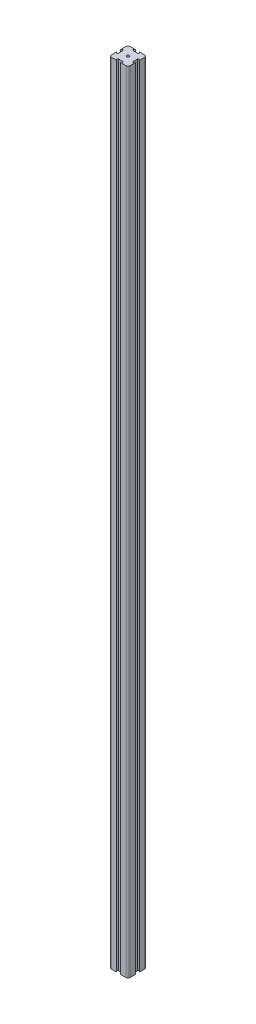
ISO-10303-21;
HEADER;
FILE_DESCRIPTION(('STEP AP214'),'2;1');
FILE_NAME('part.step','',(''),(''),'','','');
FILE_SCHEMA(('AUTOMOTIVE_DESIGN { 1 0 10303 214 1 1 1 1 }'));
ENDSEC;
DATA;
#1=APPLICATION_CONTEXT('core data for automotive mechanical design processes');
#2=APPLICATION_PROTOCOL_DEFINITION('international standard','automotive_design',2000,#1);
#3=PRODUCT_CONTEXT('',#1,'mechanical');
#4=PRODUCT('Part','Part','',(#3));
#5=PRODUCT_RELATED_PRODUCT_CATEGORY('part','',(#4));
#6=PRODUCT_DEFINITION_FORMATION('','',#4);
#7=PRODUCT_DEFINITION_CONTEXT('part definition',#1,'design');
#8=PRODUCT_DEFINITION('design','',#6,#7);
#9=PRODUCT_DEFINITION_SHAPE('','',#8);
#10=(LENGTH_UNIT() NAMED_UNIT(*) SI_UNIT(.MILLI.,.METRE.));
#11=(NAMED_UNIT(*) PLANE_ANGLE_UNIT() SI_UNIT($,.RADIAN.));
#12=(NAMED_UNIT(*) SI_UNIT($,.STERADIAN.) SOLID_ANGLE_UNIT());
#13=UNCERTAINTY_MEASURE_WITH_UNIT(LENGTH_MEASURE(1.E-05),#10,'distance_accuracy_value','');
#14=(GEOMETRIC_REPRESENTATION_CONTEXT(3) GLOBAL_UNCERTAINTY_ASSIGNED_CONTEXT((#13)) GLOBAL_UNIT_ASSIGNED_CONTEXT((#10,
#11,#12)) REPRESENTATION_CONTEXT('',''));
#15=CARTESIAN_POINT('',(0.,0.,0.));
#16=DIRECTION('',(0.,0.,1.));
#17=DIRECTION('',(1.,0.,0.));
#18=AXIS2_PLACEMENT_3D('',#15,#16,#17);
#19=CARTESIAN_POINT('',(-20.,1900.,5.));
#20=DIRECTION('',(0.,-1.,0.));
#21=DIRECTION('',(0.,0.,-1.));
#22=AXIS2_PLACEMENT_3D('',#19,#20,#21);
#23=CYLINDRICAL_SURFACE('',#22,2.5);
#24=CARTESIAN_POINT('',(-20.,0.,5.));
#25=DIRECTION('',(0.,-1.,0.));
#26=DIRECTION('',(0.,0.,-1.));
#27=AXIS2_PLACEMENT_3D('',#24,#25,#26);
#28=CIRCLE('',#27,2.5);
#29=CARTESIAN_POINT('',(-17.5,0.,5.));
#30=VERTEX_POINT('',#29);
#31=CARTESIAN_POINT('',(-22.5,0.,5.));
#32=VERTEX_POINT('',#31);
#33=EDGE_CURVE('E225',#30,#32,#28,.T.);
#34=ORIENTED_EDGE('',*,*,#33,.T.);
#35=DIRECTION('',(0.,-1.,0.));
#36=VECTOR('',#35,1.);
#37=CARTESIAN_POINT('',(-22.5,1900.,5.));
#38=LINE('',#37,#36);
#39=CARTESIAN_POINT('',(-22.5,1900.,5.));
#40=VERTEX_POINT('',#39);
#41=EDGE_CURVE('E11',#40,#32,#38,.T.);
#42=ORIENTED_EDGE('',*,*,#41,.F.);
#43=CARTESIAN_POINT('',(-20.,1900.,5.));
#44=DIRECTION('',(0.,-1.,0.));
#45=DIRECTION('',(0.,0.,-1.));
#46=AXIS2_PLACEMENT_3D('',#43,#44,#45);
#47=CIRCLE('',#46,2.5);
#48=CARTESIAN_POINT('',(-17.5,1900.,5.));
#49=VERTEX_POINT('',#48);
#50=EDGE_CURVE('E290',#49,#40,#47,.T.);
#51=ORIENTED_EDGE('',*,*,#50,.F.);
#52=DIRECTION('',(0.,-1.,0.));
#53=VECTOR('',#52,1.);
#54=CARTESIAN_POINT('',(-17.5,1900.,5.));
#55=LINE('',#54,#53);
#56=EDGE_CURVE('E221',#49,#30,#55,.T.);
#57=ORIENTED_EDGE('',*,*,#56,.T.);
#58=EDGE_LOOP('',(#34,#42,#51,#57));
#59=FACE_BOUND('',#58,.T.);
#60=ADVANCED_FACE('F33',(#59),#23,.F.);
#61=CARTESIAN_POINT('',(-22.5,1900.,5.));
#62=DIRECTION('',(1.,0.,0.));
#63=DIRECTION('',(0.,0.,-1.));
#64=AXIS2_PLACEMENT_3D('',#61,#62,#63);
#65=PLANE('',#64);
#66=DIRECTION('',(0.,0.,1.));
#67=VECTOR('',#66,1.);
#68=CARTESIAN_POINT('',(-22.5,0.,5.));
#69=LINE('',#68,#67);
#70=CARTESIAN_POINT('',(-22.5,0.,17.4999999999999));
#71=VERTEX_POINT('',#70);
#72=EDGE_CURVE('E228',#32,#71,#69,.T.);
#73=ORIENTED_EDGE('',*,*,#72,.T.);
#74=DIRECTION('',(0.,-1.,0.));
#75=VECTOR('',#74,1.);
#76=CARTESIAN_POINT('',(-22.5,1900.,17.4999999999999));
#77=LINE('',#76,#75);
#78=CARTESIAN_POINT('',(-22.5,1900.,17.4999999999999));
#79=VERTEX_POINT('',#78);
#80=EDGE_CURVE('E41',#79,#71,#77,.T.);
#81=ORIENTED_EDGE('',*,*,#80,.F.);
#82=DIRECTION('',(0.,0.,1.));
#83=VECTOR('',#82,1.);
#84=CARTESIAN_POINT('',(-22.5,1900.,5.));
#85=LINE('',#84,#83);
#86=EDGE_CURVE('E136',#40,#79,#85,.T.);
#87=ORIENTED_EDGE('',*,*,#86,.F.);
#88=ORIENTED_EDGE('',*,*,#41,.T.);
#89=EDGE_LOOP('',(#73,#81,#87,#88));
#90=FACE_BOUND('',#89,.T.);
#91=ADVANCED_FACE('F417',(#90),#65,.F.);
#92=CARTESIAN_POINT('',(-17.5,1900.,17.5));
#93=DIRECTION('',(0.,-1.,0.));
#94=DIRECTION('',(0.,0.,-1.));
#95=AXIS2_PLACEMENT_3D('',#92,#93,#94);
#96=CYLINDRICAL_SURFACE('',#95,5.);
#97=CARTESIAN_POINT('',(-17.5,0.,17.5));
#98=DIRECTION('',(0.,1.,0.));
#99=DIRECTION('',(0.,0.,1.));
#100=AXIS2_PLACEMENT_3D('',#97,#98,#99);
#101=CIRCLE('',#100,5.);
#102=CARTESIAN_POINT('',(-17.5,0.,22.5));
#103=VERTEX_POINT('',#102);
#104=EDGE_CURVE('E231',#71,#103,#101,.T.);
#105=ORIENTED_EDGE('',*,*,#104,.T.);
#106=DIRECTION('',(0.,-1.,0.));
#107=VECTOR('',#106,1.);
#108=CARTESIAN_POINT('',(-17.5,1900.,22.5));
#109=LINE('',#108,#107);
#110=CARTESIAN_POINT('',(-17.5,1900.,22.5));
#111=VERTEX_POINT('',#110);
#112=EDGE_CURVE('E329',#111,#103,#109,.T.);
#113=ORIENTED_EDGE('',*,*,#112,.F.);
#114=CARTESIAN_POINT('',(-17.5,1900.,17.5));
#115=DIRECTION('',(0.,1.,0.));
#116=DIRECTION('',(0.,0.,1.));
#117=AXIS2_PLACEMENT_3D('',#114,#115,#116);
#118=CIRCLE('',#117,5.);
#119=EDGE_CURVE('E336',#79,#111,#118,.T.);
#120=ORIENTED_EDGE('',*,*,#119,.F.);
#121=ORIENTED_EDGE('',*,*,#80,.T.);
#122=EDGE_LOOP('',(#105,#113,#120,#121));
#123=FACE_BOUND('',#122,.T.);
#124=ADVANCED_FACE('F334',(#123),#96,.T.);
#125=CARTESIAN_POINT('',(-4.99999999999998,1900.,22.5));
#126=DIRECTION('',(0.,0.,1.));
#127=DIRECTION('',(1.,0.,0.));
#128=AXIS2_PLACEMENT_3D('',#125,#126,#127);
#129=PLANE('',#128);
#130=DIRECTION('',(-1.,0.,0.));
#131=VECTOR('',#130,1.);
#132=CARTESIAN_POINT('',(-4.99999999999998,0.,22.5));
#133=LINE('',#132,#131);
#134=CARTESIAN_POINT('',(-4.99999999999998,0.,22.5));
#135=VERTEX_POINT('',#134);
#136=EDGE_CURVE('E234',#135,#103,#133,.T.);
#137=ORIENTED_EDGE('',*,*,#136,.F.);
#138=DIRECTION('',(0.,-1.,0.));
#139=VECTOR('',#138,1.);
#140=CARTESIAN_POINT('',(-4.99999999999998,1900.,22.5));
#141=LINE('',#140,#139);
#142=CARTESIAN_POINT('',(-4.99999999999998,1900.,22.5));
#143=VERTEX_POINT('',#142);
#144=EDGE_CURVE('E327',#143,#135,#141,.T.);
#145=ORIENTED_EDGE('',*,*,#144,.F.);
#146=DIRECTION('',(-1.,0.,0.));
#147=VECTOR('',#146,1.);
#148=CARTESIAN_POINT('',(-4.99999999999998,1900.,22.5));
#149=LINE('',#148,#147);
#150=EDGE_CURVE('E347',#143,#111,#149,.T.);
#151=ORIENTED_EDGE('',*,*,#150,.T.);
#152=ORIENTED_EDGE('',*,*,#112,.T.);
#153=EDGE_LOOP('',(#137,#145,#151,#152));
#154=FACE_BOUND('',#153,.T.);
#155=ADVANCED_FACE('F344',(#154),#129,.T.);
#156=CARTESIAN_POINT('',(-5.,1900.,20.));
#157=DIRECTION('',(0.,-1.,0.));
#158=DIRECTION('',(0.,0.,-1.));
#159=AXIS2_PLACEMENT_3D('',#156,#157,#158);
#160=CYLINDRICAL_SURFACE('',#159,2.5);
#161=CARTESIAN_POINT('',(-5.,0.,20.));
#162=DIRECTION('',(0.,1.,0.));
#163=DIRECTION('',(0.,0.,1.));
#164=AXIS2_PLACEMENT_3D('',#161,#162,#163);
#165=CIRCLE('',#164,2.5);
#166=CARTESIAN_POINT('',(-4.99999999999998,0.,17.5));
#167=VERTEX_POINT('',#166);
#168=EDGE_CURVE('E237',#167,#135,#165,.T.);
#169=ORIENTED_EDGE('',*,*,#168,.F.);
#170=DIRECTION('',(0.,-1.,0.));
#171=VECTOR('',#170,1.);
#172=CARTESIAN_POINT('',(-4.99999999999998,1900.,17.5));
#173=LINE('',#172,#171);
#174=CARTESIAN_POINT('',(-4.99999999999998,1900.,17.5));
#175=VERTEX_POINT('',#174);
#176=EDGE_CURVE('E325',#175,#167,#173,.T.);
#177=ORIENTED_EDGE('',*,*,#176,.F.);
#178=CARTESIAN_POINT('',(-5.,1900.,20.));
#179=DIRECTION('',(0.,1.,0.));
#180=DIRECTION('',(0.,0.,1.));
#181=AXIS2_PLACEMENT_3D('',#178,#179,#180);
#182=CIRCLE('',#181,2.5);
#183=EDGE_CURVE('E350',#175,#143,#182,.T.);
#184=ORIENTED_EDGE('',*,*,#183,.T.);
#185=ORIENTED_EDGE('',*,*,#144,.T.);
#186=EDGE_LOOP('',(#169,#177,#184,#185));
#187=FACE_BOUND('',#186,.T.);
#188=ADVANCED_FACE('F624',(#187),#160,.F.);
#189=CARTESIAN_POINT('',(-4.99999999999998,1900.,17.5));
#190=DIRECTION('',(0.,0.,-1.));
#191=DIRECTION('',(-1.,0.,0.));
#192=AXIS2_PLACEMENT_3D('',#189,#190,#191);
#193=PLANE('',#192);
#194=DIRECTION('',(1.,0.,0.));
#195=VECTOR('',#194,1.);
#196=CARTESIAN_POINT('',(-4.99999999999998,0.,17.5));
#197=LINE('',#196,#195);
#198=CARTESIAN_POINT('',(5.00000000000002,0.,17.5));
#199=VERTEX_POINT('',#198);
#200=EDGE_CURVE('E240',#167,#199,#197,.T.);
#201=ORIENTED_EDGE('',*,*,#200,.T.);
#202=DIRECTION('',(0.,-1.,0.));
#203=VECTOR('',#202,1.);
#204=CARTESIAN_POINT('',(5.00000000000002,1900.,17.5));
#205=LINE('',#204,#203);
#206=CARTESIAN_POINT('',(5.00000000000002,1900.,17.5));
#207=VERTEX_POINT('',#206);
#208=EDGE_CURVE('E323',#207,#199,#205,.T.);
#209=ORIENTED_EDGE('',*,*,#208,.F.);
#210=DIRECTION('',(1.,0.,0.));
#211=VECTOR('',#210,1.);
#212=CARTESIAN_POINT('',(-4.99999999999998,1900.,17.5));
#213=LINE('',#212,#211);
#214=EDGE_CURVE('E352',#175,#207,#213,.T.);
#215=ORIENTED_EDGE('',*,*,#214,.F.);
#216=ORIENTED_EDGE('',*,*,#176,.T.);
#217=EDGE_LOOP('',(#201,#209,#215,#216));
#218=FACE_BOUND('',#217,.T.);
#219=ADVANCED_FACE('F614',(#218),#193,.F.);
#220=CARTESIAN_POINT('',(4.99999999999996,1900.,20.));
#221=DIRECTION('',(0.,-1.,0.));
#222=DIRECTION('',(0.,0.,-1.));
#223=AXIS2_PLACEMENT_3D('',#220,#221,#222);
#224=CYLINDRICAL_SURFACE('',#223,2.50000000000001);
#225=CARTESIAN_POINT('',(4.99999999999996,0.,20.));
#226=DIRECTION('',(0.,1.,0.));
#227=DIRECTION('',(0.,0.,1.));
#228=AXIS2_PLACEMENT_3D('',#225,#226,#227);
#229=CIRCLE('',#228,2.50000000000001);
#230=CARTESIAN_POINT('',(4.99999999999996,0.,22.5));
#231=VERTEX_POINT('',#230);
#232=EDGE_CURVE('E243',#231,#199,#229,.T.);
#233=ORIENTED_EDGE('',*,*,#232,.F.);
#234=DIRECTION('',(0.,-1.,0.));
#235=VECTOR('',#234,1.);
#236=CARTESIAN_POINT('',(4.99999999999996,1900.,22.5));
#237=LINE('',#236,#235);
#238=CARTESIAN_POINT('',(4.99999999999996,1900.,22.5));
#239=VERTEX_POINT('',#238);
#240=EDGE_CURVE('E321',#239,#231,#237,.T.);
#241=ORIENTED_EDGE('',*,*,#240,.F.);
#242=CARTESIAN_POINT('',(4.99999999999996,1900.,20.));
#243=DIRECTION('',(0.,1.,0.));
#244=DIRECTION('',(0.,0.,1.));
#245=AXIS2_PLACEMENT_3D('',#242,#243,#244);
#246=CIRCLE('',#245,2.50000000000001);
#247=EDGE_CURVE('E358',#239,#207,#246,.T.);
#248=ORIENTED_EDGE('',*,*,#247,.T.);
#249=ORIENTED_EDGE('',*,*,#208,.T.);
#250=EDGE_LOOP('',(#233,#241,#248,#249));
#251=FACE_BOUND('',#250,.T.);
#252=ADVANCED_FACE('F604',(#251),#224,.F.);
#253=CARTESIAN_POINT('',(4.99999999999996,1900.,22.5));
#254=DIRECTION('',(0.,0.,-1.));
#255=DIRECTION('',(-1.,0.,0.));
#256=AXIS2_PLACEMENT_3D('',#253,#254,#255);
#257=PLANE('',#256);
#258=DIRECTION('',(1.,0.,0.));
#259=VECTOR('',#258,1.);
#260=CARTESIAN_POINT('',(4.99999999999996,0.,22.5));
#261=LINE('',#260,#259);
#262=CARTESIAN_POINT('',(17.5,0.,22.5));
#263=VERTEX_POINT('',#262);
#264=EDGE_CURVE('E246',#231,#263,#261,.T.);
#265=ORIENTED_EDGE('',*,*,#264,.T.);
#266=DIRECTION('',(0.,-1.,0.));
#267=VECTOR('',#266,1.);
#268=CARTESIAN_POINT('',(17.5,1900.,22.5));
#269=LINE('',#268,#267);
#270=CARTESIAN_POINT('',(17.5,1900.,22.5));
#271=VERTEX_POINT('',#270);
#272=EDGE_CURVE('E318',#271,#263,#269,.T.);
#273=ORIENTED_EDGE('',*,*,#272,.F.);
#274=DIRECTION('',(1.,0.,0.));
#275=VECTOR('',#274,1.);
#276=CARTESIAN_POINT('',(4.99999999999996,1900.,22.5));
#277=LINE('',#276,#275);
#278=EDGE_CURVE('E361',#239,#271,#277,.T.);
#279=ORIENTED_EDGE('',*,*,#278,.F.);
#280=ORIENTED_EDGE('',*,*,#240,.T.);
#281=EDGE_LOOP('',(#265,#273,#279,#280));
#282=FACE_BOUND('',#281,.T.);
#283=ADVANCED_FACE('F594',(#282),#257,.F.);
#284=CARTESIAN_POINT('',(17.5000000000006,1900.,17.5));
#285=DIRECTION('',(0.,-1.,0.));
#286=DIRECTION('',(0.,0.,-1.));
#287=AXIS2_PLACEMENT_3D('',#284,#285,#286);
#288=CYLINDRICAL_SURFACE('',#287,5.);
#289=CARTESIAN_POINT('',(17.5000000000006,0.,17.5));
#290=DIRECTION('',(0.,1.,0.));
#291=DIRECTION('',(0.,0.,1.));
#292=AXIS2_PLACEMENT_3D('',#289,#290,#291);
#293=CIRCLE('',#292,5.);
#294=CARTESIAN_POINT('',(22.5,0.,17.5000025246919));
#295=VERTEX_POINT('',#294);
#296=EDGE_CURVE('E248',#263,#295,#293,.T.);
#297=ORIENTED_EDGE('',*,*,#296,.T.);
#298=DIRECTION('',(0.,-1.,0.));
#299=VECTOR('',#298,1.);
#300=CARTESIAN_POINT('',(22.5,1900.,17.5000025246919));
#301=LINE('',#300,#299);
#302=CARTESIAN_POINT('',(22.5,1900.,17.5000025246919));
#303=VERTEX_POINT('',#302);
#304=EDGE_CURVE('E316',#303,#295,#301,.T.);
#305=ORIENTED_EDGE('',*,*,#304,.F.);
#306=CARTESIAN_POINT('',(17.5000000000006,1900.,17.5));
#307=DIRECTION('',(0.,1.,0.));
#308=DIRECTION('',(0.,0.,1.));
#309=AXIS2_PLACEMENT_3D('',#306,#307,#308);
#310=CIRCLE('',#309,5.);
#311=EDGE_CURVE('E363',#271,#303,#310,.T.);
#312=ORIENTED_EDGE('',*,*,#311,.F.);
#313=ORIENTED_EDGE('',*,*,#272,.T.);
#314=EDGE_LOOP('',(#297,#305,#312,#313));
#315=FACE_BOUND('',#314,.T.);
#316=ADVANCED_FACE('F584',(#315),#288,.T.);
#317=CARTESIAN_POINT('',(22.5,1900.,5.00000252469196));
#318=DIRECTION('',(1.,0.,0.));
#319=DIRECTION('',(0.,0.,-1.));
#320=AXIS2_PLACEMENT_3D('',#317,#318,#319);
#321=PLANE('',#320);
#322=DIRECTION('',(0.,0.,1.));
#323=VECTOR('',#322,1.);
#324=CARTESIAN_POINT('',(22.5,0.,5.00000252469196));
#325=LINE('',#324,#323);
#326=CARTESIAN_POINT('',(22.5,0.,5.00000252469196));
#327=VERTEX_POINT('',#326);
#328=EDGE_CURVE('E251',#327,#295,#325,.T.);
#329=ORIENTED_EDGE('',*,*,#328,.F.);
#330=DIRECTION('',(0.,-1.,0.));
#331=VECTOR('',#330,1.);
#332=CARTESIAN_POINT('',(22.5,1900.,5.00000252469196));
#333=LINE('',#332,#331);
#334=CARTESIAN_POINT('',(22.5,1900.,5.00000252469196));
#335=VERTEX_POINT('',#334);
#336=EDGE_CURVE('E314',#335,#327,#333,.T.);
#337=ORIENTED_EDGE('',*,*,#336,.F.);
#338=DIRECTION('',(0.,0.,1.));
#339=VECTOR('',#338,1.);
#340=CARTESIAN_POINT('',(22.5,1900.,5.00000252469196));
#341=LINE('',#340,#339);
#342=EDGE_CURVE('E365',#335,#303,#341,.T.);
#343=ORIENTED_EDGE('',*,*,#342,.T.);
#344=ORIENTED_EDGE('',*,*,#304,.T.);
#345=EDGE_LOOP('',(#329,#337,#343,#344));
#346=FACE_BOUND('',#345,.T.);
#347=ADVANCED_FACE('F574',(#346),#321,.T.);
#348=CARTESIAN_POINT('',(20.,1900.,5.00000252469196));
#349=DIRECTION('',(0.,-1.,0.));
#350=DIRECTION('',(0.,0.,-1.));
#351=AXIS2_PLACEMENT_3D('',#348,#349,#350);
#352=CYLINDRICAL_SURFACE('',#351,2.5);
#353=CARTESIAN_POINT('',(20.,0.,5.00000252469196));
#354=DIRECTION('',(0.,-1.,0.));
#355=DIRECTION('',(0.,0.,-1.));
#356=AXIS2_PLACEMENT_3D('',#353,#354,#355);
#357=CIRCLE('',#356,2.5);
#358=CARTESIAN_POINT('',(17.5,0.,5.00000252469196));
#359=VERTEX_POINT('',#358);
#360=EDGE_CURVE('E254',#327,#359,#357,.T.);
#361=ORIENTED_EDGE('',*,*,#360,.T.);
#362=DIRECTION('',(0.,-1.,0.));
#363=VECTOR('',#362,1.);
#364=CARTESIAN_POINT('',(17.5,1900.,5.00000252469196));
#365=LINE('',#364,#363);
#366=CARTESIAN_POINT('',(17.5,1900.,5.00000252469196));
#367=VERTEX_POINT('',#366);
#368=EDGE_CURVE('E312',#367,#359,#365,.T.);
#369=ORIENTED_EDGE('',*,*,#368,.F.);
#370=CARTESIAN_POINT('',(20.,1900.,5.00000252469196));
#371=DIRECTION('',(0.,-1.,0.));
#372=DIRECTION('',(0.,0.,-1.));
#373=AXIS2_PLACEMENT_3D('',#370,#371,#372);
#374=CIRCLE('',#373,2.5);
#375=EDGE_CURVE('E368',#335,#367,#374,.T.);
#376=ORIENTED_EDGE('',*,*,#375,.F.);
#377=ORIENTED_EDGE('',*,*,#336,.T.);
#378=EDGE_LOOP('',(#361,#369,#376,#377));
#379=FACE_BOUND('',#378,.T.);
#380=ADVANCED_FACE('F564',(#379),#352,.F.);
#381=CARTESIAN_POINT('',(17.5,1900.,-4.99999747530804));
#382=DIRECTION('',(1.,0.,0.));
#383=DIRECTION('',(0.,0.,-1.));
#384=AXIS2_PLACEMENT_3D('',#381,#382,#383);
#385=PLANE('',#384);
#386=DIRECTION('',(0.,0.,1.));
#387=VECTOR('',#386,1.);
#388=CARTESIAN_POINT('',(17.5,0.,-4.99999747530804));
#389=LINE('',#388,#387);
#390=CARTESIAN_POINT('',(17.5,0.,-4.99999747530804));
#391=VERTEX_POINT('',#390);
#392=EDGE_CURVE('E257',#391,#359,#389,.T.);
#393=ORIENTED_EDGE('',*,*,#392,.F.);
#394=DIRECTION('',(0.,-1.,0.));
#395=VECTOR('',#394,1.);
#396=CARTESIAN_POINT('',(17.5,1900.,-4.99999747530804));
#397=LINE('',#396,#395);
#398=CARTESIAN_POINT('',(17.5,1900.,-4.99999747530804));
#399=VERTEX_POINT('',#398);
#400=EDGE_CURVE('E310',#399,#391,#397,.T.);
#401=ORIENTED_EDGE('',*,*,#400,.F.);
#402=DIRECTION('',(0.,0.,1.));
#403=VECTOR('',#402,1.);
#404=CARTESIAN_POINT('',(17.5,1900.,-4.99999747530804));
#405=LINE('',#404,#403);
#406=EDGE_CURVE('E370',#399,#367,#405,.T.);
#407=ORIENTED_EDGE('',*,*,#406,.T.);
#408=ORIENTED_EDGE('',*,*,#368,.T.);
#409=EDGE_LOOP('',(#393,#401,#407,#408));
#410=FACE_BOUND('',#409,.T.);
#411=ADVANCED_FACE('F554',(#410),#385,.T.);
#412=CARTESIAN_POINT('',(20.,1900.,-4.99999747530804));
#413=DIRECTION('',(0.,-1.,0.));
#414=DIRECTION('',(0.,0.,-1.));
#415=AXIS2_PLACEMENT_3D('',#412,#413,#414);
#416=CYLINDRICAL_SURFACE('',#415,2.5);
#417=CARTESIAN_POINT('',(20.,0.,-4.99999747530804));
#418=DIRECTION('',(0.,1.,0.));
#419=DIRECTION('',(0.,0.,1.));
#420=AXIS2_PLACEMENT_3D('',#417,#418,#419);
#421=CIRCLE('',#420,2.5);
#422=CARTESIAN_POINT('',(22.5,0.,-4.99999747530804));
#423=VERTEX_POINT('',#422);
#424=EDGE_CURVE('E260',#423,#391,#421,.T.);
#425=ORIENTED_EDGE('',*,*,#424,.F.);
#426=DIRECTION('',(0.,-1.,0.));
#427=VECTOR('',#426,1.);
#428=CARTESIAN_POINT('',(22.5,1900.,-4.99999747530804));
#429=LINE('',#428,#427);
#430=CARTESIAN_POINT('',(22.5,1900.,-4.99999747530804));
#431=VERTEX_POINT('',#430);
#432=EDGE_CURVE('E308',#431,#423,#429,.T.);
#433=ORIENTED_EDGE('',*,*,#432,.F.);
#434=CARTESIAN_POINT('',(20.,1900.,-4.99999747530804));
#435=DIRECTION('',(0.,1.,0.));
#436=DIRECTION('',(0.,0.,1.));
#437=AXIS2_PLACEMENT_3D('',#434,#435,#436);
#438=CIRCLE('',#437,2.5);
#439=EDGE_CURVE('E373',#431,#399,#438,.T.);
#440=ORIENTED_EDGE('',*,*,#439,.T.);
#441=ORIENTED_EDGE('',*,*,#400,.T.);
#442=EDGE_LOOP('',(#425,#433,#440,#441));
#443=FACE_BOUND('',#442,.T.);
#444=ADVANCED_FACE('F544',(#443),#416,.F.);
#445=CARTESIAN_POINT('',(22.5,1900.,-4.99999747530804));
#446=DIRECTION('',(-1.,0.,0.));
#447=DIRECTION('',(0.,0.,1.));
#448=AXIS2_PLACEMENT_3D('',#445,#446,#447);
#449=PLANE('',#448);
#450=DIRECTION('',(0.,0.,-1.));
#451=VECTOR('',#450,1.);
#452=CARTESIAN_POINT('',(22.5,0.,-4.99999747530804));
#453=LINE('',#452,#451);
#454=CARTESIAN_POINT('',(22.5,0.,-17.499997475308));
#455=VERTEX_POINT('',#454);
#456=EDGE_CURVE('E263',#423,#455,#453,.T.);
#457=ORIENTED_EDGE('',*,*,#456,.T.);
#458=DIRECTION('',(0.,-1.,0.));
#459=VECTOR('',#458,1.);
#460=CARTESIAN_POINT('',(22.5,1900.,-17.499997475308));
#461=LINE('',#460,#459);
#462=CARTESIAN_POINT('',(22.5,1900.,-17.499997475308));
#463=VERTEX_POINT('',#462);
#464=EDGE_CURVE('E306',#463,#455,#461,.T.);
#465=ORIENTED_EDGE('',*,*,#464,.F.);
#466=DIRECTION('',(0.,0.,-1.));
#467=VECTOR('',#466,1.);
#468=CARTESIAN_POINT('',(22.5,1900.,-4.99999747530804));
#469=LINE('',#468,#467);
#470=EDGE_CURVE('E376',#431,#463,#469,.T.);
#471=ORIENTED_EDGE('',*,*,#470,.F.);
#472=ORIENTED_EDGE('',*,*,#432,.T.);
#473=EDGE_LOOP('',(#457,#465,#471,#472));
#474=FACE_BOUND('',#473,.T.);
#475=ADVANCED_FACE('F534',(#474),#449,.F.);
#476=CARTESIAN_POINT('',(17.5000000000006,1900.,-17.5));
#477=DIRECTION('',(0.,-1.,0.));
#478=DIRECTION('',(0.,0.,-1.));
#479=AXIS2_PLACEMENT_3D('',#476,#477,#478);
#480=CYLINDRICAL_SURFACE('',#479,5.00000000000001);
#481=CARTESIAN_POINT('',(17.5000000000006,0.,-17.5));
#482=DIRECTION('',(0.,-1.,0.));
#483=DIRECTION('',(0.,0.,-1.));
#484=AXIS2_PLACEMENT_3D('',#481,#482,#483);
#485=CIRCLE('',#484,5.00000000000001);
#486=CARTESIAN_POINT('',(17.5,0.,-22.5));
#487=VERTEX_POINT('',#486);
#488=EDGE_CURVE('E266',#487,#455,#485,.T.);
#489=ORIENTED_EDGE('',*,*,#488,.F.);
#490=DIRECTION('',(0.,-1.,0.));
#491=VECTOR('',#490,1.);
#492=CARTESIAN_POINT('',(17.5,1900.,-22.5));
#493=LINE('',#492,#491);
#494=CARTESIAN_POINT('',(17.5,1900.,-22.5));
#495=VERTEX_POINT('',#494);
#496=EDGE_CURVE('E304',#495,#487,#493,.T.);
#497=ORIENTED_EDGE('',*,*,#496,.F.);
#498=CARTESIAN_POINT('',(17.5000000000006,1900.,-17.5));
#499=DIRECTION('',(0.,-1.,0.));
#500=DIRECTION('',(0.,0.,-1.));
#501=AXIS2_PLACEMENT_3D('',#498,#499,#500);
#502=CIRCLE('',#501,5.00000000000001);
#503=EDGE_CURVE('E378',#495,#463,#502,.T.);
#504=ORIENTED_EDGE('',*,*,#503,.T.);
#505=ORIENTED_EDGE('',*,*,#464,.T.);
#506=EDGE_LOOP('',(#489,#497,#504,#505));
#507=FACE_BOUND('',#506,.T.);
#508=ADVANCED_FACE('F524',(#507),#480,.T.);
#509=CARTESIAN_POINT('',(5.00000000000003,1900.,-22.5));
#510=DIRECTION('',(0.,0.,-1.));
#511=DIRECTION('',(-1.,0.,0.));
#512=AXIS2_PLACEMENT_3D('',#509,#510,#511);
#513=PLANE('',#512);
#514=DIRECTION('',(1.,0.,0.));
#515=VECTOR('',#514,1.);
#516=CARTESIAN_POINT('',(5.00000000000003,0.,-22.5));
#517=LINE('',#516,#515);
#518=CARTESIAN_POINT('',(5.00000000000003,0.,-22.5));
#519=VERTEX_POINT('',#518);
#520=EDGE_CURVE('E269',#519,#487,#517,.T.);
#521=ORIENTED_EDGE('',*,*,#520,.F.);
#522=DIRECTION('',(0.,-1.,0.));
#523=VECTOR('',#522,1.);
#524=CARTESIAN_POINT('',(5.00000000000003,1900.,-22.5));
#525=LINE('',#524,#523);
#526=CARTESIAN_POINT('',(5.00000000000003,1900.,-22.5));
#527=VERTEX_POINT('',#526);
#528=EDGE_CURVE('E302',#527,#519,#525,.T.);
#529=ORIENTED_EDGE('',*,*,#528,.F.);
#530=DIRECTION('',(1.,0.,0.));
#531=VECTOR('',#530,1.);
#532=CARTESIAN_POINT('',(5.00000000000003,1900.,-22.5));
#533=LINE('',#532,#531);
#534=EDGE_CURVE('E381',#527,#495,#533,.T.);
#535=ORIENTED_EDGE('',*,*,#534,.T.);
#536=ORIENTED_EDGE('',*,*,#496,.T.);
#537=EDGE_LOOP('',(#521,#529,#535,#536));
#538=FACE_BOUND('',#537,.T.);
#539=ADVANCED_FACE('F514',(#538),#513,.T.);
#540=CARTESIAN_POINT('',(5.00000000000003,1900.,-20.));
#541=DIRECTION('',(0.,-1.,0.));
#542=DIRECTION('',(0.,0.,-1.));
#543=AXIS2_PLACEMENT_3D('',#540,#541,#542);
#544=CYLINDRICAL_SURFACE('',#543,2.50000000000001);
#545=CARTESIAN_POINT('',(5.00000000000003,0.,-20.));
#546=DIRECTION('',(0.,1.,0.));
#547=DIRECTION('',(0.,0.,1.));
#548=AXIS2_PLACEMENT_3D('',#545,#546,#547);
#549=CIRCLE('',#548,2.50000000000001);
#550=CARTESIAN_POINT('',(5.00000000000001,0.,-17.5));
#551=VERTEX_POINT('',#550);
#552=EDGE_CURVE('E272',#551,#519,#549,.T.);
#553=ORIENTED_EDGE('',*,*,#552,.F.);
#554=DIRECTION('',(0.,-1.,0.));
#555=VECTOR('',#554,1.);
#556=CARTESIAN_POINT('',(5.00000000000001,1900.,-17.5));
#557=LINE('',#556,#555);
#558=CARTESIAN_POINT('',(5.00000000000001,1900.,-17.5));
#559=VERTEX_POINT('',#558);
#560=EDGE_CURVE('E300',#559,#551,#557,.T.);
#561=ORIENTED_EDGE('',*,*,#560,.F.);
#562=CARTESIAN_POINT('',(5.00000000000003,1900.,-20.));
#563=DIRECTION('',(0.,1.,0.));
#564=DIRECTION('',(0.,0.,1.));
#565=AXIS2_PLACEMENT_3D('',#562,#563,#564);
#566=CIRCLE('',#565,2.50000000000001);
#567=EDGE_CURVE('E384',#559,#527,#566,.T.);
#568=ORIENTED_EDGE('',*,*,#567,.T.);
#569=ORIENTED_EDGE('',*,*,#528,.T.);
#570=EDGE_LOOP('',(#553,#561,#568,#569));
#571=FACE_BOUND('',#570,.T.);
#572=ADVANCED_FACE('F504',(#571),#544,.F.);
#573=CARTESIAN_POINT('',(-5.,1900.,-17.5));
#574=DIRECTION('',(0.,0.,-1.));
#575=DIRECTION('',(-1.,0.,0.));
#576=AXIS2_PLACEMENT_3D('',#573,#574,#575);
#577=PLANE('',#576);
#578=DIRECTION('',(1.,0.,0.));
#579=VECTOR('',#578,1.);
#580=CARTESIAN_POINT('',(-5.,0.,-17.5));
#581=LINE('',#580,#579);
#582=CARTESIAN_POINT('',(-5.,0.,-17.5));
#583=VERTEX_POINT('',#582);
#584=EDGE_CURVE('E275',#583,#551,#581,.T.);
#585=ORIENTED_EDGE('',*,*,#584,.F.);
#586=DIRECTION('',(0.,-1.,0.));
#587=VECTOR('',#586,1.);
#588=CARTESIAN_POINT('',(-5.,1900.,-17.5));
#589=LINE('',#588,#587);
#590=CARTESIAN_POINT('',(-5.,1900.,-17.5));
#591=VERTEX_POINT('',#590);
#592=EDGE_CURVE('E298',#591,#583,#589,.T.);
#593=ORIENTED_EDGE('',*,*,#592,.F.);
#594=DIRECTION('',(1.,0.,0.));
#595=VECTOR('',#594,1.);
#596=CARTESIAN_POINT('',(-5.,1900.,-17.5));
#597=LINE('',#596,#595);
#598=EDGE_CURVE('E387',#591,#559,#597,.T.);
#599=ORIENTED_EDGE('',*,*,#598,.T.);
#600=ORIENTED_EDGE('',*,*,#560,.T.);
#601=EDGE_LOOP('',(#585,#593,#599,#600));
#602=FACE_BOUND('',#601,.T.);
#603=ADVANCED_FACE('F495',(#602),#577,.T.);
#604=CARTESIAN_POINT('',(-5.00000000000003,1900.,-20.));
#605=DIRECTION('',(0.,-1.,0.));
#606=DIRECTION('',(0.,0.,-1.));
#607=AXIS2_PLACEMENT_3D('',#604,#605,#606);
#608=CYLINDRICAL_SURFACE('',#607,2.5);
#609=CARTESIAN_POINT('',(-5.00000000000003,0.,-20.));
#610=DIRECTION('',(0.,1.,0.));
#611=DIRECTION('',(0.,0.,1.));
#612=AXIS2_PLACEMENT_3D('',#609,#610,#611);
#613=CIRCLE('',#612,2.5);
#614=CARTESIAN_POINT('',(-5.00000000000003,0.,-22.5));
#615=VERTEX_POINT('',#614);
#616=EDGE_CURVE('E278',#615,#583,#613,.T.);
#617=ORIENTED_EDGE('',*,*,#616,.F.);
#618=DIRECTION('',(0.,-1.,0.));
#619=VECTOR('',#618,1.);
#620=CARTESIAN_POINT('',(-5.00000000000003,1900.,-22.5));
#621=LINE('',#620,#619);
#622=CARTESIAN_POINT('',(-5.00000000000003,1900.,-22.5));
#623=VERTEX_POINT('',#622);
#624=EDGE_CURVE('E296',#623,#615,#621,.T.);
#625=ORIENTED_EDGE('',*,*,#624,.F.);
#626=CARTESIAN_POINT('',(-5.00000000000003,1900.,-20.));
#627=DIRECTION('',(0.,1.,0.));
#628=DIRECTION('',(0.,0.,1.));
#629=AXIS2_PLACEMENT_3D('',#626,#627,#628);
#630=CIRCLE('',#629,2.5);
#631=EDGE_CURVE('E390',#623,#591,#630,.T.);
#632=ORIENTED_EDGE('',*,*,#631,.T.);
#633=ORIENTED_EDGE('',*,*,#592,.T.);
#634=EDGE_LOOP('',(#617,#625,#632,#633));
#635=FACE_BOUND('',#634,.T.);
#636=ADVANCED_FACE('F403',(#635),#608,.F.);
#637=CARTESIAN_POINT('',(-17.5,1900.,-22.5));
#638=DIRECTION('',(0.,0.,-1.));
#639=DIRECTION('',(-1.,0.,0.));
#640=AXIS2_PLACEMENT_3D('',#637,#638,#639);
#641=PLANE('',#640);
#642=DIRECTION('',(1.,0.,0.));
#643=VECTOR('',#642,1.);
#644=CARTESIAN_POINT('',(-17.5,0.,-22.5));
#645=LINE('',#644,#643);
#646=CARTESIAN_POINT('',(-17.5,0.,-22.5));
#647=VERTEX_POINT('',#646);
#648=EDGE_CURVE('E281',#647,#615,#645,.T.);
#649=ORIENTED_EDGE('',*,*,#648,.F.);
#650=DIRECTION('',(0.,-1.,0.));
#651=VECTOR('',#650,1.);
#652=CARTESIAN_POINT('',(-17.5,1900.,-22.5));
#653=LINE('',#652,#651);
#654=CARTESIAN_POINT('',(-17.5,1900.,-22.5));
#655=VERTEX_POINT('',#654);
#656=EDGE_CURVE('E294',#655,#647,#653,.T.);
#657=ORIENTED_EDGE('',*,*,#656,.F.);
#658=DIRECTION('',(1.,0.,0.));
#659=VECTOR('',#658,1.);
#660=CARTESIAN_POINT('',(-17.5,1900.,-22.5));
#661=LINE('',#660,#659);
#662=EDGE_CURVE('E393',#655,#623,#661,.T.);
#663=ORIENTED_EDGE('',*,*,#662,.T.);
#664=ORIENTED_EDGE('',*,*,#624,.T.);
#665=EDGE_LOOP('',(#649,#657,#663,#664));
#666=FACE_BOUND('',#665,.T.);
#667=ADVANCED_FACE('F397',(#666),#641,.T.);
#668=CARTESIAN_POINT('',(-17.5,1900.,-17.5));
#669=DIRECTION('',(0.,-1.,0.));
#670=DIRECTION('',(0.,0.,-1.));
#671=AXIS2_PLACEMENT_3D('',#668,#669,#670);
#672=CYLINDRICAL_SURFACE('',#671,5.00000000000001);
#673=CARTESIAN_POINT('',(-17.5,0.,-17.5));
#674=DIRECTION('',(0.,1.,0.));
#675=DIRECTION('',(0.,0.,1.));
#676=AXIS2_PLACEMENT_3D('',#673,#674,#675);
#677=CIRCLE('',#676,5.00000000000001);
#678=CARTESIAN_POINT('',(-22.5,0.,-17.5));
#679=VERTEX_POINT('',#678);
#680=EDGE_CURVE('E284',#647,#679,#677,.T.);
#681=ORIENTED_EDGE('',*,*,#680,.T.);
#682=DIRECTION('',(0.,-1.,0.));
#683=VECTOR('',#682,1.);
#684=CARTESIAN_POINT('',(-22.5,1900.,-17.5));
#685=LINE('',#684,#683);
#686=CARTESIAN_POINT('',(-22.5,1900.,-17.5));
#687=VERTEX_POINT('',#686);
#688=EDGE_CURVE('E217',#687,#679,#685,.T.);
#689=ORIENTED_EDGE('',*,*,#688,.F.);
#690=CARTESIAN_POINT('',(-17.5,1900.,-17.5));
#691=DIRECTION('',(0.,1.,0.));
#692=DIRECTION('',(0.,0.,1.));
#693=AXIS2_PLACEMENT_3D('',#690,#691,#692);
#694=CIRCLE('',#693,5.00000000000001);
#695=EDGE_CURVE('E204',#655,#687,#694,.T.);
#696=ORIENTED_EDGE('',*,*,#695,.F.);
#697=ORIENTED_EDGE('',*,*,#656,.T.);
#698=EDGE_LOOP('',(#681,#689,#696,#697));
#699=FACE_BOUND('',#698,.T.);
#700=ADVANCED_FACE('F407',(#699),#672,.T.);
#701=CARTESIAN_POINT('',(-22.5,1900.,-17.5));
#702=DIRECTION('',(1.,0.,0.));
#703=DIRECTION('',(0.,0.,-1.));
#704=AXIS2_PLACEMENT_3D('',#701,#702,#703);
#705=PLANE('',#704);
#706=DIRECTION('',(0.,0.,1.));
#707=VECTOR('',#706,1.);
#708=CARTESIAN_POINT('',(-22.5,0.,-17.5));
#709=LINE('',#708,#707);
#710=CARTESIAN_POINT('',(-22.5,0.,-5.));
#711=VERTEX_POINT('',#710);
#712=EDGE_CURVE('E213',#679,#711,#709,.T.);
#713=ORIENTED_EDGE('',*,*,#712,.T.);
#714=DIRECTION('',(0.,-1.,0.));
#715=VECTOR('',#714,1.);
#716=CARTESIAN_POINT('',(-22.5,1900.,-5.));
#717=LINE('',#716,#715);
#718=CARTESIAN_POINT('',(-22.5,1900.,-5.));
#719=VERTEX_POINT('',#718);
#720=EDGE_CURVE('E210',#719,#711,#717,.T.);
#721=ORIENTED_EDGE('',*,*,#720,.F.);
#722=DIRECTION('',(0.,0.,1.));
#723=VECTOR('',#722,1.);
#724=CARTESIAN_POINT('',(-22.5,1900.,-17.5));
#725=LINE('',#724,#723);
#726=EDGE_CURVE('E197',#687,#719,#725,.T.);
#727=ORIENTED_EDGE('',*,*,#726,.F.);
#728=ORIENTED_EDGE('',*,*,#688,.T.);
#729=EDGE_LOOP('',(#713,#721,#727,#728));
#730=FACE_BOUND('',#729,.T.);
#731=ADVANCED_FACE('F211',(#730),#705,.F.);
#732=CARTESIAN_POINT('',(-20.,1900.,-5.));
#733=DIRECTION('',(0.,-1.,0.));
#734=DIRECTION('',(0.,0.,-1.));
#735=AXIS2_PLACEMENT_3D('',#732,#733,#734);
#736=CYLINDRICAL_SURFACE('',#735,2.5);
#737=CARTESIAN_POINT('',(-20.,0.,-5.));
#738=DIRECTION('',(0.,1.,0.));
#739=DIRECTION('',(0.,0.,1.));
#740=AXIS2_PLACEMENT_3D('',#737,#738,#739);
#741=CIRCLE('',#740,2.5);
#742=CARTESIAN_POINT('',(-17.5,0.,-5.));
#743=VERTEX_POINT('',#742);
#744=EDGE_CURVE('E287',#743,#711,#741,.T.);
#745=ORIENTED_EDGE('',*,*,#744,.F.);
#746=DIRECTION('',(0.,-1.,0.));
#747=VECTOR('',#746,1.);
#748=CARTESIAN_POINT('',(-17.5,1900.,-5.));
#749=LINE('',#748,#747);
#750=CARTESIAN_POINT('',(-17.5,1900.,-5.));
#751=VERTEX_POINT('',#750);
#752=EDGE_CURVE('E125',#751,#743,#749,.T.);
#753=ORIENTED_EDGE('',*,*,#752,.F.);
#754=CARTESIAN_POINT('',(-20.,1900.,-5.));
#755=DIRECTION('',(0.,1.,0.));
#756=DIRECTION('',(0.,0.,1.));
#757=AXIS2_PLACEMENT_3D('',#754,#755,#756);
#758=CIRCLE('',#757,2.5);
#759=EDGE_CURVE('E201',#751,#719,#758,.T.);
#760=ORIENTED_EDGE('',*,*,#759,.T.);
#761=ORIENTED_EDGE('',*,*,#720,.T.);
#762=EDGE_LOOP('',(#745,#753,#760,#761));
#763=FACE_BOUND('',#762,.T.);
#764=ADVANCED_FACE('F219',(#763),#736,.F.);
#765=CARTESIAN_POINT('',(-17.5,1900.,-5.));
#766=DIRECTION('',(1.,0.,0.));
#767=DIRECTION('',(0.,0.,-1.));
#768=AXIS2_PLACEMENT_3D('',#765,#766,#767);
#769=PLANE('',#768);
#770=DIRECTION('',(0.,0.,1.));
#771=VECTOR('',#770,1.);
#772=CARTESIAN_POINT('',(-17.5,0.,-5.));
#773=LINE('',#772,#771);
#774=EDGE_CURVE('E128',#743,#30,#773,.T.);
#775=ORIENTED_EDGE('',*,*,#774,.T.);
#776=ORIENTED_EDGE('',*,*,#56,.F.);
#777=DIRECTION('',(0.,0.,1.));
#778=VECTOR('',#777,1.);
#779=CARTESIAN_POINT('',(-17.5,1900.,-5.));
#780=LINE('',#779,#778);
#781=EDGE_CURVE('E49',#751,#49,#780,.T.);
#782=ORIENTED_EDGE('',*,*,#781,.F.);
#783=ORIENTED_EDGE('',*,*,#752,.T.);
#784=EDGE_LOOP('',(#775,#776,#782,#783));
#785=FACE_BOUND('',#784,.T.);
#786=ADVANCED_FACE('F424',(#785),#769,.F.);
#787=CARTESIAN_POINT('',(-20.,1900.,5.));
#788=DIRECTION('',(0.,-1.,0.));
#789=DIRECTION('',(0.,0.,-1.));
#790=AXIS2_PLACEMENT_3D('',#787,#788,#789);
#791=PLANE('',#790);
#792=CARTESIAN_POINT('',(0.,1900.,0.));
#793=DIRECTION('',(0.,-1.,0.));
#794=DIRECTION('',(0.,0.,-1.));
#795=AXIS2_PLACEMENT_3D('',#792,#793,#794);
#796=CIRCLE('',#795,3.);
#797=CARTESIAN_POINT('',(0.,1900.,-3.));
#798=VERTEX_POINT('',#797);
#799=EDGE_CURVE('E229',#798,#798,#796,.T.);
#800=ORIENTED_EDGE('',*,*,#799,.T.);
#801=EDGE_LOOP('',(#800));
#802=FACE_BOUND('',#801,.T.);
#803=ORIENTED_EDGE('',*,*,#50,.T.);
#804=ORIENTED_EDGE('',*,*,#86,.T.);
#805=ORIENTED_EDGE('',*,*,#119,.T.);
#806=ORIENTED_EDGE('',*,*,#150,.F.);
#807=ORIENTED_EDGE('',*,*,#183,.F.);
#808=ORIENTED_EDGE('',*,*,#214,.T.);
#809=ORIENTED_EDGE('',*,*,#247,.F.);
#810=ORIENTED_EDGE('',*,*,#278,.T.);
#811=ORIENTED_EDGE('',*,*,#311,.T.);
#812=ORIENTED_EDGE('',*,*,#342,.F.);
#813=ORIENTED_EDGE('',*,*,#375,.T.);
#814=ORIENTED_EDGE('',*,*,#406,.F.);
#815=ORIENTED_EDGE('',*,*,#439,.F.);
#816=ORIENTED_EDGE('',*,*,#470,.T.);
#817=ORIENTED_EDGE('',*,*,#503,.F.);
#818=ORIENTED_EDGE('',*,*,#534,.F.);
#819=ORIENTED_EDGE('',*,*,#567,.F.);
#820=ORIENTED_EDGE('',*,*,#598,.F.);
#821=ORIENTED_EDGE('',*,*,#631,.F.);
#822=ORIENTED_EDGE('',*,*,#662,.F.);
#823=ORIENTED_EDGE('',*,*,#695,.T.);
#824=ORIENTED_EDGE('',*,*,#726,.T.);
#825=ORIENTED_EDGE('',*,*,#759,.F.);
#826=ORIENTED_EDGE('',*,*,#781,.T.);
#827=EDGE_LOOP('',(#803,#804,#805,#806,#807,#808,#809,#810,#811,#812,#813,#814,#815,#816,#817,
#818,#819,#820,#821,#822,#823,#824,#825,#826));
#828=FACE_BOUND('',#827,.T.);
#829=ADVANCED_FACE('F199',(#802,#828),#791,.F.);
#830=CARTESIAN_POINT('',(-20.,0.,5.));
#831=DIRECTION('',(0.,-1.,0.));
#832=DIRECTION('',(0.,0.,-1.));
#833=AXIS2_PLACEMENT_3D('',#830,#831,#832);
#834=PLANE('',#833);
#835=CARTESIAN_POINT('',(0.,0.,0.));
#836=DIRECTION('',(0.,-1.,0.));
#837=DIRECTION('',(0.,0.,-1.));
#838=AXIS2_PLACEMENT_3D('',#835,#836,#837);
#839=CIRCLE('',#838,3.);
#840=CARTESIAN_POINT('',(0.,2.22044604925031E-13,-3.));
#841=VERTEX_POINT('',#840);
#842=EDGE_CURVE('E448',#841,#841,#839,.T.);
#843=ORIENTED_EDGE('',*,*,#842,.F.);
#844=EDGE_LOOP('',(#843));
#845=FACE_BOUND('',#844,.T.);
#846=ORIENTED_EDGE('',*,*,#33,.F.);
#847=ORIENTED_EDGE('',*,*,#774,.F.);
#848=ORIENTED_EDGE('',*,*,#744,.T.);
#849=ORIENTED_EDGE('',*,*,#712,.F.);
#850=ORIENTED_EDGE('',*,*,#680,.F.);
#851=ORIENTED_EDGE('',*,*,#648,.T.);
#852=ORIENTED_EDGE('',*,*,#616,.T.);
#853=ORIENTED_EDGE('',*,*,#584,.T.);
#854=ORIENTED_EDGE('',*,*,#552,.T.);
#855=ORIENTED_EDGE('',*,*,#520,.T.);
#856=ORIENTED_EDGE('',*,*,#488,.T.);
#857=ORIENTED_EDGE('',*,*,#456,.F.);
#858=ORIENTED_EDGE('',*,*,#424,.T.);
#859=ORIENTED_EDGE('',*,*,#392,.T.);
#860=ORIENTED_EDGE('',*,*,#360,.F.);
#861=ORIENTED_EDGE('',*,*,#328,.T.);
#862=ORIENTED_EDGE('',*,*,#296,.F.);
#863=ORIENTED_EDGE('',*,*,#264,.F.);
#864=ORIENTED_EDGE('',*,*,#232,.T.);
#865=ORIENTED_EDGE('',*,*,#200,.F.);
#866=ORIENTED_EDGE('',*,*,#168,.T.);
#867=ORIENTED_EDGE('',*,*,#136,.T.);
#868=ORIENTED_EDGE('',*,*,#104,.F.);
#869=ORIENTED_EDGE('',*,*,#72,.F.);
#870=EDGE_LOOP('',(#846,#847,#848,#849,#850,#851,#852,#853,#854,#855,#856,#857,#858,#859,#860,
#861,#862,#863,#864,#865,#866,#867,#868,#869));
#871=FACE_BOUND('',#870,.T.);
#872=ADVANCED_FACE('F339',(#845,#871),#834,.T.);
#873=CARTESIAN_POINT('',(0.,1900.,0.));
#874=DIRECTION('',(0.,-1.,0.));
#875=DIRECTION('',(0.,0.,-1.));
#876=AXIS2_PLACEMENT_3D('',#873,#874,#875);
#877=CYLINDRICAL_SURFACE('',#876,3.);
#878=CARTESIAN_POINT('',(0.,1900.,-3.));
#879=CARTESIAN_POINT('',(0.,1880.20833333333,-3.));
#880=CARTESIAN_POINT('',(0.,1860.41666666667,-3.));
#881=CARTESIAN_POINT('',(0.,1820.83333333333,-3.));
#882=CARTESIAN_POINT('',(0.,1801.04166666667,-3.));
#883=CARTESIAN_POINT('',(0.,1761.45833333333,-3.));
#884=CARTESIAN_POINT('',(0.,1741.66666666667,-3.));
#885=CARTESIAN_POINT('',(0.,1702.08333333333,-3.));
#886=CARTESIAN_POINT('',(0.,1682.29166666667,-3.));
#887=CARTESIAN_POINT('',(0.,1642.70833333333,-3.));
#888=CARTESIAN_POINT('',(0.,1622.91666666667,-3.));
#889=CARTESIAN_POINT('',(0.,1583.33333333333,-3.));
#890=CARTESIAN_POINT('',(0.,1563.54166666667,-3.));
#891=CARTESIAN_POINT('',(0.,1523.95833333333,-3.));
#892=CARTESIAN_POINT('',(0.,1504.16666666667,-3.));
#893=CARTESIAN_POINT('',(0.,1464.58333333333,-3.));
#894=CARTESIAN_POINT('',(0.,1444.79166666667,-3.));
#895=CARTESIAN_POINT('',(0.,1405.20833333333,-3.));
#896=CARTESIAN_POINT('',(0.,1385.41666666667,-3.));
#897=CARTESIAN_POINT('',(0.,1345.83333333333,-3.));
#898=CARTESIAN_POINT('',(0.,1326.04166666667,-3.));
#899=CARTESIAN_POINT('',(0.,1286.45833333333,-3.));
#900=CARTESIAN_POINT('',(0.,1266.66666666667,-3.));
#901=CARTESIAN_POINT('',(0.,1227.08333333333,-3.));
#902=CARTESIAN_POINT('',(0.,1207.29166666667,-3.));
#903=CARTESIAN_POINT('',(0.,1167.70833333333,-3.));
#904=CARTESIAN_POINT('',(0.,1147.91666666667,-3.));
#905=CARTESIAN_POINT('',(0.,1108.33333333333,-3.));
#906=CARTESIAN_POINT('',(0.,1088.54166666667,-3.));
#907=CARTESIAN_POINT('',(0.,1048.95833333333,-3.));
#908=CARTESIAN_POINT('',(0.,1029.16666666667,-3.));
#909=CARTESIAN_POINT('',(0.,989.583333333333,-3.));
#910=CARTESIAN_POINT('',(0.,969.791666666667,-3.));
#911=CARTESIAN_POINT('',(0.,930.208333333333,-3.));
#912=CARTESIAN_POINT('',(0.,910.416666666667,-3.));
#913=CARTESIAN_POINT('',(0.,870.833333333334,-3.));
#914=CARTESIAN_POINT('',(0.,851.041666666667,-3.));
#915=CARTESIAN_POINT('',(0.,811.458333333333,-3.));
#916=CARTESIAN_POINT('',(0.,791.666666666667,-3.));
#917=CARTESIAN_POINT('',(0.,752.083333333333,-3.));
#918=CARTESIAN_POINT('',(0.,732.291666666667,-3.));
#919=CARTESIAN_POINT('',(0.,692.708333333333,-3.));
#920=CARTESIAN_POINT('',(0.,672.916666666667,-3.));
#921=CARTESIAN_POINT('',(0.,633.333333333333,-3.));
#922=CARTESIAN_POINT('',(0.,613.541666666667,-3.));
#923=CARTESIAN_POINT('',(0.,573.958333333334,-3.));
#924=CARTESIAN_POINT('',(0.,554.166666666667,-3.));
#925=CARTESIAN_POINT('',(0.,514.583333333334,-3.));
#926=CARTESIAN_POINT('',(0.,494.791666666667,-3.));
#927=CARTESIAN_POINT('',(0.,455.208333333334,-3.));
#928=CARTESIAN_POINT('',(0.,435.416666666667,-3.));
#929=CARTESIAN_POINT('',(0.,395.833333333333,-3.));
#930=CARTESIAN_POINT('',(0.,376.041666666667,-3.));
#931=CARTESIAN_POINT('',(0.,336.458333333334,-3.));
#932=CARTESIAN_POINT('',(0.,316.666666666667,-3.));
#933=CARTESIAN_POINT('',(0.,277.083333333334,-3.));
#934=CARTESIAN_POINT('',(0.,257.291666666667,-3.));
#935=CARTESIAN_POINT('',(0.,217.708333333334,-3.));
#936=CARTESIAN_POINT('',(0.,197.916666666667,-3.));
#937=CARTESIAN_POINT('',(0.,158.333333333334,-3.));
#938=CARTESIAN_POINT('',(0.,138.541666666667,-3.));
#939=CARTESIAN_POINT('',(0.,98.9583333333335,-3.));
#940=CARTESIAN_POINT('',(0.,79.1666666666668,-3.));
#941=CARTESIAN_POINT('',(0.,39.5833333333335,-3.));
#942=CARTESIAN_POINT('',(0.,19.7916666666669,-3.));
#943=CARTESIAN_POINT('',(0.,2.22044604925031E-13,-3.));
#944=B_SPLINE_CURVE_WITH_KNOTS('',3,(#878,#879,#880,#881,#882,#883,#884,#885,#886,#887,#888,
#889,#890,#891,#892,#893,#894,#895,#896,#897,#898,#899,#900,#901,#902,#903,#904,#905,#906,#907,
#908,#909,#910,#911,#912,#913,#914,#915,#916,#917,#918,#919,#920,#921,#922,#923,#924,#925,#926,
#927,#928,#929,#930,#931,#932,#933,#934,#935,#936,#937,#938,#939,#940,#941,#942,#943),
.UNSPECIFIED.,.F.,.F.,(4,2,2,2,2,2,2,2,2,2,2,2,2,2,2,2,2,2,2,2,2,2,2,2,2,2,2,2,2,2,2,2,4),(0.,
59.375,118.75,178.125,237.5,296.875,356.25,415.625,475.,534.375,593.75,653.125,712.5,771.875,
831.25,890.625,950.,1009.375,1068.75,1128.125,1187.5,1246.875,1306.25,1365.625,1425.,1484.375,
1543.75,1603.125,1662.5,1721.875,1781.25,1840.625,1900.),.UNSPECIFIED.);
#945=EDGE_CURVE('BSEAM436',#798,#841,#944,.T.);
#946=ORIENTED_EDGE('',*,*,#799,.F.);
#947=ORIENTED_EDGE('',*,*,#842,.T.);
#948=ORIENTED_EDGE('',*,*,#945,.T.);
#949=ORIENTED_EDGE('',*,*,#945,.F.);
#950=EDGE_LOOP('',(#946,#948,#947,#949));
#951=FACE_BOUND('',#950,.T.);
#952=ADVANCED_FACE('F436',(#951),#877,.F.);
#953=CLOSED_SHELL('',(#60,#91,#124,#155,#188,#219,#252,#283,#316,#347,#380,#411,#444,#475,#508,
#539,#572,#603,#636,#667,#700,#731,#764,#786,#829,#872,#952));
#954=MANIFOLD_SOLID_BREP('B2',#953);
#955=ADVANCED_BREP_SHAPE_REPRESENTATION('',(#18,#954),#14);
#956=SHAPE_DEFINITION_REPRESENTATION(#9,#955);
ENDSEC;
END-ISO-10303-21;
